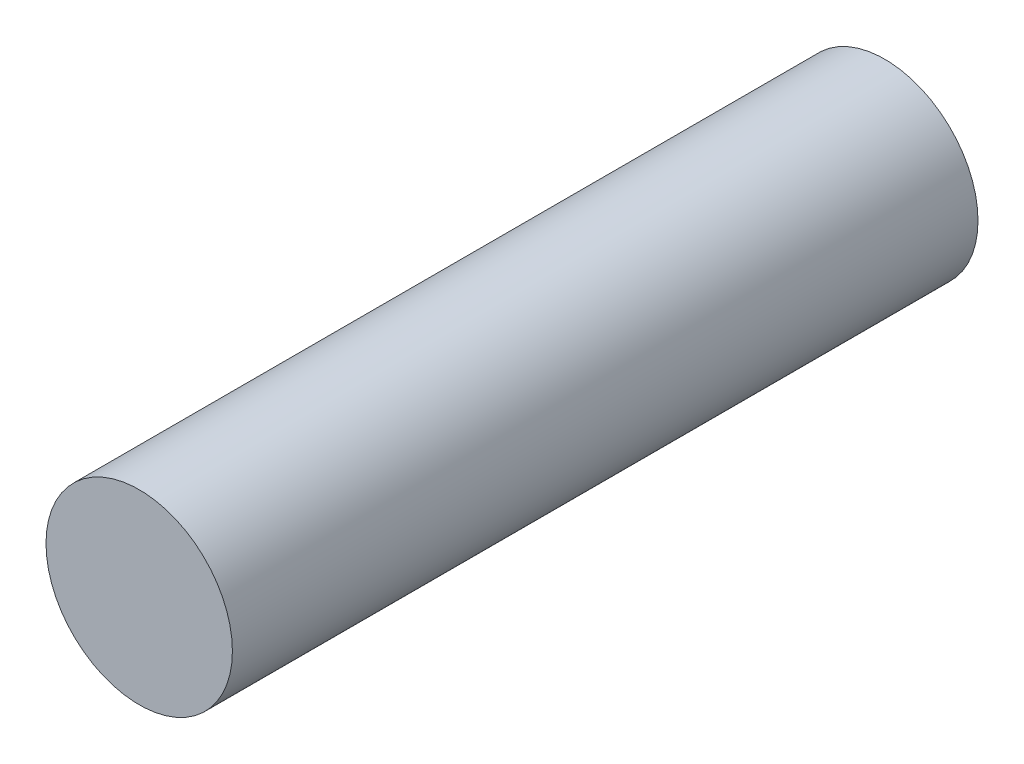
ISO-10303-21;
HEADER;
FILE_DESCRIPTION(('STEP AP214'),'2;1');
FILE_NAME('part.step','',(''),(''),'','','');
FILE_SCHEMA(('AUTOMOTIVE_DESIGN { 1 0 10303 214 1 1 1 1 }'));
ENDSEC;
DATA;
#1=APPLICATION_CONTEXT('core data for automotive mechanical design processes');
#2=APPLICATION_PROTOCOL_DEFINITION('international standard','automotive_design',2000,#1);
#3=PRODUCT_CONTEXT('',#1,'mechanical');
#4=PRODUCT('Part','Part','',(#3));
#5=PRODUCT_RELATED_PRODUCT_CATEGORY('part','',(#4));
#6=PRODUCT_DEFINITION_FORMATION('','',#4);
#7=PRODUCT_DEFINITION_CONTEXT('part definition',#1,'design');
#8=PRODUCT_DEFINITION('design','',#6,#7);
#9=PRODUCT_DEFINITION_SHAPE('','',#8);
#10=(LENGTH_UNIT() NAMED_UNIT(*) SI_UNIT(.MILLI.,.METRE.));
#11=(NAMED_UNIT(*) PLANE_ANGLE_UNIT() SI_UNIT($,.RADIAN.));
#12=(NAMED_UNIT(*) SI_UNIT($,.STERADIAN.) SOLID_ANGLE_UNIT());
#13=UNCERTAINTY_MEASURE_WITH_UNIT(LENGTH_MEASURE(1.E-05),#10,'distance_accuracy_value','');
#14=(GEOMETRIC_REPRESENTATION_CONTEXT(3) GLOBAL_UNCERTAINTY_ASSIGNED_CONTEXT((#13)) GLOBAL_UNIT_ASSIGNED_CONTEXT((#10,
#11,#12)) REPRESENTATION_CONTEXT('',''));
#15=CARTESIAN_POINT('',(0.,0.,0.));
#16=DIRECTION('',(0.,0.,1.));
#17=DIRECTION('',(1.,0.,0.));
#18=AXIS2_PLACEMENT_3D('',#15,#16,#17);
#19=CARTESIAN_POINT('',(-5.14667319358944,5.63352065784791,50.8));
#20=DIRECTION('',(0.,0.,-1.));
#21=DIRECTION('',(-1.,0.,0.));
#22=AXIS2_PLACEMENT_3D('',#19,#20,#21);
#23=CYLINDRICAL_SURFACE('',#22,6.35);
#24=CARTESIAN_POINT('',(-5.14667319358944,5.63352065784791,50.8));
#25=DIRECTION('',(0.,0.,1.));
#26=DIRECTION('',(1.,0.,0.));
#27=AXIS2_PLACEMENT_3D('',#24,#25,#26);
#28=CIRCLE('',#27,6.35);
#29=CARTESIAN_POINT('',(1.20332680641056,5.63352065784791,50.8));
#30=VERTEX_POINT('',#29);
#31=EDGE_CURVE('E10',#30,#30,#28,.T.);
#32=ORIENTED_EDGE('',*,*,#31,.F.);
#33=EDGE_LOOP('',(#32));
#34=FACE_BOUND('',#33,.T.);
#35=CARTESIAN_POINT('',(-5.14667319358944,5.63352065784791,0.));
#36=DIRECTION('',(0.,0.,1.));
#37=DIRECTION('',(1.,0.,0.));
#38=AXIS2_PLACEMENT_3D('',#35,#36,#37);
#39=CIRCLE('',#38,6.35);
#40=CARTESIAN_POINT('',(1.20332680641056,5.63352065784791,0.));
#41=VERTEX_POINT('',#40);
#42=EDGE_CURVE('E35',#41,#41,#39,.T.);
#43=ORIENTED_EDGE('',*,*,#42,.T.);
#44=EDGE_LOOP('',(#43));
#45=FACE_BOUND('',#44,.T.);
#46=ADVANCED_FACE('F32',(#34,#45),#23,.T.);
#47=CARTESIAN_POINT('',(-5.14667319358944,5.63352065784791,50.8));
#48=DIRECTION('',(0.,0.,1.));
#49=DIRECTION('',(1.,0.,0.));
#50=AXIS2_PLACEMENT_3D('',#47,#48,#49);
#51=PLANE('',#50);
#52=ORIENTED_EDGE('',*,*,#31,.T.);
#53=EDGE_LOOP('',(#52));
#54=FACE_BOUND('',#53,.T.);
#55=ADVANCED_FACE('F61',(#54),#51,.T.);
#56=CARTESIAN_POINT('',(-5.14667319358944,5.63352065784791,0.));
#57=DIRECTION('',(0.,0.,1.));
#58=DIRECTION('',(1.,0.,0.));
#59=AXIS2_PLACEMENT_3D('',#56,#57,#58);
#60=PLANE('',#59);
#61=CARTESIAN_POINT('',(-5.14667319358944,5.63352065784791,0.));
#62=DIRECTION('',(0.,0.,-1.));
#63=DIRECTION('',(-1.,0.,0.));
#64=AXIS2_PLACEMENT_3D('',#61,#62,#63);
#65=CIRCLE('',#64,2.0193);
#66=CARTESIAN_POINT('',(-7.16597319358944,5.63352065784791,0.));
#67=VERTEX_POINT('',#66);
#68=EDGE_CURVE('E44',#67,#67,#65,.T.);
#69=ORIENTED_EDGE('',*,*,#68,.F.);
#70=EDGE_LOOP('',(#69));
#71=FACE_BOUND('',#70,.T.);
#72=ORIENTED_EDGE('',*,*,#42,.F.);
#73=EDGE_LOOP('',(#72));
#74=FACE_BOUND('',#73,.T.);
#75=ADVANCED_FACE('F55',(#71,#74),#60,.F.);
#76=CARTESIAN_POINT('',(-5.14667319358944,5.63352065784791,19.05));
#77=DIRECTION('',(0.,0.,-1.));
#78=DIRECTION('',(-1.,0.,0.));
#79=AXIS2_PLACEMENT_3D('',#76,#77,#78);
#80=CYLINDRICAL_SURFACE('',#79,2.0193);
#81=CARTESIAN_POINT('',(-5.14667319358944,5.63352065784791,19.05));
#82=DIRECTION('',(0.,0.,-1.));
#83=DIRECTION('',(-1.,0.,0.));
#84=AXIS2_PLACEMENT_3D('',#81,#82,#83);
#85=CIRCLE('',#84,2.0193);
#86=CARTESIAN_POINT('',(-7.16597319358944,5.63352065784791,19.05));
#87=VERTEX_POINT('',#86);
#88=EDGE_CURVE('E42',#87,#87,#85,.T.);
#89=CARTESIAN_POINT('',(-7.16597319358944,5.63352065784791,19.05));
#90=CARTESIAN_POINT('',(-7.16597319358944,5.63352065784791,18.8515625));
#91=CARTESIAN_POINT('',(-7.16597319358944,5.63352065784791,18.653125));
#92=CARTESIAN_POINT('',(-7.16597319358944,5.63352065784791,18.25625));
#93=CARTESIAN_POINT('',(-7.16597319358944,5.63352065784791,18.0578125));
#94=CARTESIAN_POINT('',(-7.16597319358944,5.63352065784791,17.6609375));
#95=CARTESIAN_POINT('',(-7.16597319358944,5.63352065784791,17.4625));
#96=CARTESIAN_POINT('',(-7.16597319358944,5.63352065784791,17.065625));
#97=CARTESIAN_POINT('',(-7.16597319358944,5.63352065784791,16.8671875));
#98=CARTESIAN_POINT('',(-7.16597319358944,5.63352065784791,16.4703125));
#99=CARTESIAN_POINT('',(-7.16597319358944,5.63352065784791,16.271875));
#100=CARTESIAN_POINT('',(-7.16597319358944,5.63352065784791,15.875));
#101=CARTESIAN_POINT('',(-7.16597319358944,5.63352065784791,15.6765625));
#102=CARTESIAN_POINT('',(-7.16597319358944,5.63352065784791,15.2796875));
#103=CARTESIAN_POINT('',(-7.16597319358944,5.63352065784791,15.08125));
#104=CARTESIAN_POINT('',(-7.16597319358944,5.63352065784791,14.684375));
#105=CARTESIAN_POINT('',(-7.16597319358944,5.63352065784791,14.4859375));
#106=CARTESIAN_POINT('',(-7.16597319358944,5.63352065784791,14.0890625));
#107=CARTESIAN_POINT('',(-7.16597319358944,5.63352065784791,13.890625));
#108=CARTESIAN_POINT('',(-7.16597319358944,5.63352065784791,13.49375));
#109=CARTESIAN_POINT('',(-7.16597319358944,5.63352065784791,13.2953125));
#110=CARTESIAN_POINT('',(-7.16597319358944,5.63352065784791,12.8984375));
#111=CARTESIAN_POINT('',(-7.16597319358944,5.63352065784791,12.7));
#112=CARTESIAN_POINT('',(-7.16597319358944,5.63352065784791,12.303125));
#113=CARTESIAN_POINT('',(-7.16597319358944,5.63352065784791,12.1046875));
#114=CARTESIAN_POINT('',(-7.16597319358944,5.63352065784791,11.7078125));
#115=CARTESIAN_POINT('',(-7.16597319358944,5.63352065784791,11.509375));
#116=CARTESIAN_POINT('',(-7.16597319358944,5.63352065784791,11.1125));
#117=CARTESIAN_POINT('',(-7.16597319358944,5.63352065784791,10.9140625));
#118=CARTESIAN_POINT('',(-7.16597319358944,5.63352065784791,10.5171875));
#119=CARTESIAN_POINT('',(-7.16597319358944,5.63352065784791,10.31875));
#120=CARTESIAN_POINT('',(-7.16597319358944,5.63352065784791,9.921875));
#121=CARTESIAN_POINT('',(-7.16597319358944,5.63352065784791,9.7234375));
#122=CARTESIAN_POINT('',(-7.16597319358944,5.63352065784791,9.3265625));
#123=CARTESIAN_POINT('',(-7.16597319358944,5.63352065784791,9.128125));
#124=CARTESIAN_POINT('',(-7.16597319358944,5.63352065784791,8.73125));
#125=CARTESIAN_POINT('',(-7.16597319358944,5.63352065784791,8.5328125));
#126=CARTESIAN_POINT('',(-7.16597319358944,5.63352065784791,8.1359375));
#127=CARTESIAN_POINT('',(-7.16597319358944,5.63352065784791,7.9375));
#128=CARTESIAN_POINT('',(-7.16597319358944,5.63352065784791,7.540625));
#129=CARTESIAN_POINT('',(-7.16597319358944,5.63352065784791,7.3421875));
#130=CARTESIAN_POINT('',(-7.16597319358944,5.63352065784791,6.9453125));
#131=CARTESIAN_POINT('',(-7.16597319358944,5.63352065784791,6.746875));
#132=CARTESIAN_POINT('',(-7.16597319358944,5.63352065784791,6.35));
#133=CARTESIAN_POINT('',(-7.16597319358944,5.63352065784791,6.1515625));
#134=CARTESIAN_POINT('',(-7.16597319358944,5.63352065784791,5.7546875));
#135=CARTESIAN_POINT('',(-7.16597319358944,5.63352065784791,5.55625));
#136=CARTESIAN_POINT('',(-7.16597319358944,5.63352065784791,5.159375));
#137=CARTESIAN_POINT('',(-7.16597319358944,5.63352065784791,4.9609375));
#138=CARTESIAN_POINT('',(-7.16597319358944,5.63352065784791,4.5640625));
#139=CARTESIAN_POINT('',(-7.16597319358944,5.63352065784791,4.365625));
#140=CARTESIAN_POINT('',(-7.16597319358944,5.63352065784791,3.96875));
#141=CARTESIAN_POINT('',(-7.16597319358944,5.63352065784791,3.7703125));
#142=CARTESIAN_POINT('',(-7.16597319358944,5.63352065784791,3.3734375));
#143=CARTESIAN_POINT('',(-7.16597319358944,5.63352065784791,3.175));
#144=CARTESIAN_POINT('',(-7.16597319358944,5.63352065784791,2.778125));
#145=CARTESIAN_POINT('',(-7.16597319358944,5.63352065784791,2.5796875));
#146=CARTESIAN_POINT('',(-7.16597319358944,5.63352065784791,2.1828125));
#147=CARTESIAN_POINT('',(-7.16597319358944,5.63352065784791,1.984375));
#148=CARTESIAN_POINT('',(-7.16597319358944,5.63352065784791,1.5875));
#149=CARTESIAN_POINT('',(-7.16597319358944,5.63352065784791,1.3890625));
#150=CARTESIAN_POINT('',(-7.16597319358944,5.63352065784791,0.992187500000001));
#151=CARTESIAN_POINT('',(-7.16597319358944,5.63352065784791,0.793750000000001));
#152=CARTESIAN_POINT('',(-7.16597319358944,5.63352065784791,0.396875));
#153=CARTESIAN_POINT('',(-7.16597319358944,5.63352065784791,0.1984375));
#154=CARTESIAN_POINT('',(-7.16597319358944,5.63352065784791,0.));
#155=B_SPLINE_CURVE_WITH_KNOTS('',3,(#89,#90,#91,#92,#93,#94,#95,#96,#97,#98,#99,#100,#101,#102,
#103,#104,#105,#106,#107,#108,#109,#110,#111,#112,#113,#114,#115,#116,#117,#118,#119,#120,#121,
#122,#123,#124,#125,#126,#127,#128,#129,#130,#131,#132,#133,#134,#135,#136,#137,#138,#139,#140,
#141,#142,#143,#144,#145,#146,#147,#148,#149,#150,#151,#152,#153,#154),.UNSPECIFIED.,.F.,.F.,(4,
2,2,2,2,2,2,2,2,2,2,2,2,2,2,2,2,2,2,2,2,2,2,2,2,2,2,2,2,2,2,2,4),(0.,0.595312499999997,1.190625,
1.7859375,2.38125,2.9765625,3.571875,4.1671875,4.7625,5.3578125,5.953125,6.5484375,7.14375,
7.7390625,8.334375,8.9296875,9.525,10.1203125,10.715625,11.3109375,11.90625,12.5015625,
13.096875,13.6921875,14.2875,14.8828125,15.478125,16.0734375,16.66875,17.2640625,17.859375,
18.4546875,19.05),.UNSPECIFIED.);
#156=EDGE_CURVE('BSEAM52',#87,#67,#155,.T.);
#157=ORIENTED_EDGE('',*,*,#88,.F.);
#158=ORIENTED_EDGE('',*,*,#68,.T.);
#159=ORIENTED_EDGE('',*,*,#156,.T.);
#160=ORIENTED_EDGE('',*,*,#156,.F.);
#161=EDGE_LOOP('',(#157,#159,#158,#160));
#162=FACE_BOUND('',#161,.T.);
#163=ADVANCED_FACE('F52',(#162),#80,.F.);
#164=CARTESIAN_POINT('',(-5.14667319358944,5.63352065784791,19.05));
#165=DIRECTION('',(0.,0.,-1.));
#166=DIRECTION('',(-1.,0.,0.));
#167=AXIS2_PLACEMENT_3D('',#164,#165,#166);
#168=PLANE('',#167);
#169=ORIENTED_EDGE('',*,*,#88,.T.);
#170=EDGE_LOOP('',(#169));
#171=FACE_BOUND('',#170,.T.);
#172=ADVANCED_FACE('F50',(#171),#168,.T.);
#173=CLOSED_SHELL('',(#46,#55,#75,#163,#172));
#174=MANIFOLD_SOLID_BREP('B2',#173);
#175=ADVANCED_BREP_SHAPE_REPRESENTATION('',(#18,#174),#14);
#176=SHAPE_DEFINITION_REPRESENTATION(#9,#175);
ENDSEC;
END-ISO-10303-21;
